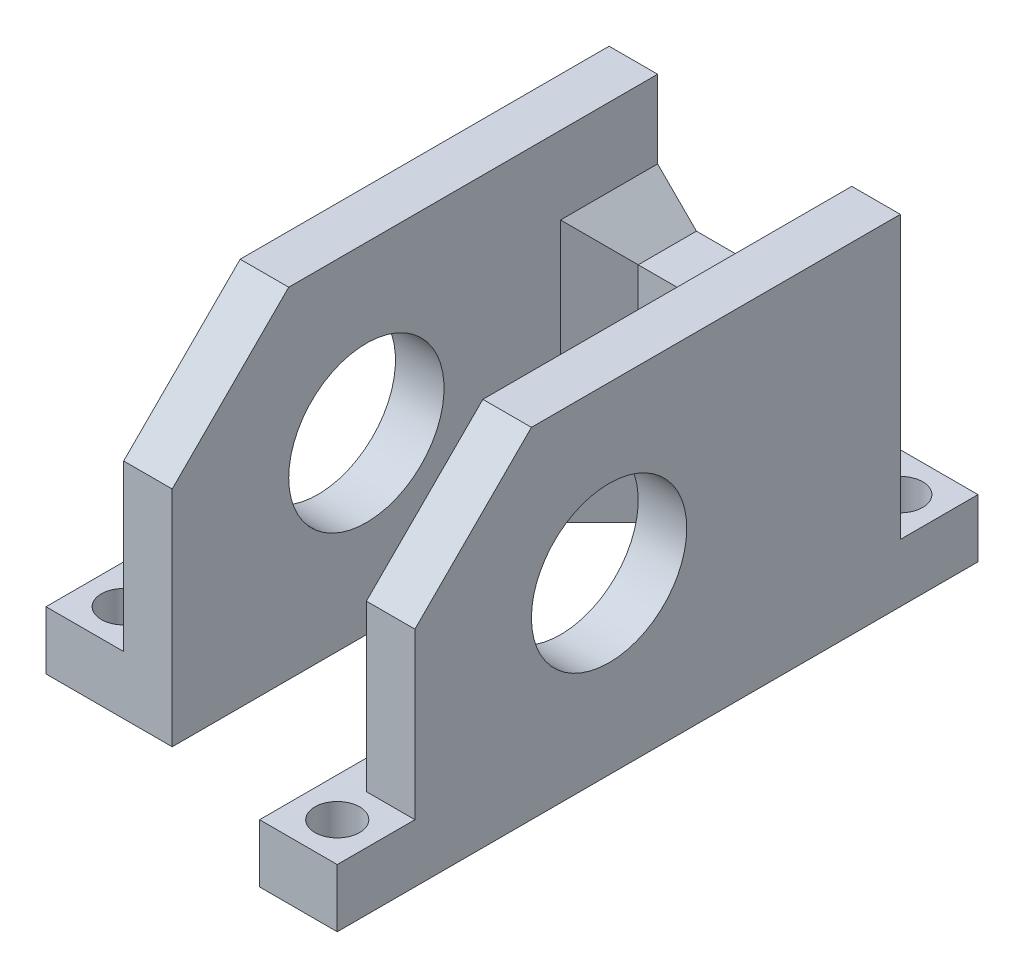
ISO-10303-21;
HEADER;
FILE_DESCRIPTION(('STEP AP214'),'2;1');
FILE_NAME('part.step','',(''),(''),'','','');
FILE_SCHEMA(('AUTOMOTIVE_DESIGN { 1 0 10303 214 1 1 1 1 }'));
ENDSEC;
DATA;
#1=APPLICATION_CONTEXT('core data for automotive mechanical design processes');
#2=APPLICATION_PROTOCOL_DEFINITION('international standard','automotive_design',2000,#1);
#3=PRODUCT_CONTEXT('',#1,'mechanical');
#4=PRODUCT('Part','Part','',(#3));
#5=PRODUCT_RELATED_PRODUCT_CATEGORY('part','',(#4));
#6=PRODUCT_DEFINITION_FORMATION('','',#4);
#7=PRODUCT_DEFINITION_CONTEXT('part definition',#1,'design');
#8=PRODUCT_DEFINITION('design','',#6,#7);
#9=PRODUCT_DEFINITION_SHAPE('','',#8);
#10=(LENGTH_UNIT() NAMED_UNIT(*) SI_UNIT(.MILLI.,.METRE.));
#11=(NAMED_UNIT(*) PLANE_ANGLE_UNIT() SI_UNIT($,.RADIAN.));
#12=(NAMED_UNIT(*) SI_UNIT($,.STERADIAN.) SOLID_ANGLE_UNIT());
#13=UNCERTAINTY_MEASURE_WITH_UNIT(LENGTH_MEASURE(1.E-05),#10,'distance_accuracy_value','');
#14=(GEOMETRIC_REPRESENTATION_CONTEXT(3) GLOBAL_UNCERTAINTY_ASSIGNED_CONTEXT((#13)) GLOBAL_UNIT_ASSIGNED_CONTEXT((#10,
#11,#12)) REPRESENTATION_CONTEXT('',''));
#15=CARTESIAN_POINT('',(0.,0.,0.));
#16=DIRECTION('',(0.,0.,1.));
#17=DIRECTION('',(1.,0.,0.));
#18=AXIS2_PLACEMENT_3D('',#15,#16,#17);
#19=CARTESIAN_POINT('',(0.,35.,-9.));
#20=DIRECTION('',(0.,0.,-1.));
#21=DIRECTION('',(-1.,0.,0.));
#22=AXIS2_PLACEMENT_3D('',#19,#20,#21);
#23=PLANE('',#22);
#24=DIRECTION('',(-0.707106781186548,-0.707106781186548,0.));
#25=VECTOR('',#24,1.);
#26=CARTESIAN_POINT('',(-12.5,12.5,-9.));
#27=LINE('',#26,#25);
#28=CARTESIAN_POINT('',(2.,27.,-9.));
#29=VERTEX_POINT('',#28);
#30=CARTESIAN_POINT('',(-2.,23.,-9.));
#31=VERTEX_POINT('',#30);
#32=EDGE_CURVE('E510',#29,#31,#27,.T.);
#33=ORIENTED_EDGE('',*,*,#32,.F.);
#34=DIRECTION('',(0.,1.,0.));
#35=VECTOR('',#34,1.);
#36=CARTESIAN_POINT('',(2.,0.,-9.));
#37=LINE('',#36,#35);
#38=CARTESIAN_POINT('',(2.,35.,-9.));
#39=VERTEX_POINT('',#38);
#40=EDGE_CURVE('E507',#29,#39,#37,.T.);
#41=ORIENTED_EDGE('',*,*,#40,.T.);
#42=DIRECTION('',(1.,0.,0.));
#43=VECTOR('',#42,1.);
#44=CARTESIAN_POINT('',(0.,35.,-9.));
#45=LINE('',#44,#43);
#46=CARTESIAN_POINT('',(7.,35.,-9.));
#47=VERTEX_POINT('',#46);
#48=EDGE_CURVE('E244',#39,#47,#45,.T.);
#49=ORIENTED_EDGE('',*,*,#48,.T.);
#50=DIRECTION('',(0.,-1.,0.));
#51=VECTOR('',#50,1.);
#52=CARTESIAN_POINT('',(7.,35.,-9.));
#53=LINE('',#52,#51);
#54=CARTESIAN_POINT('',(7.,6.,-9.));
#55=VERTEX_POINT('',#54);
#56=EDGE_CURVE('E252',#47,#55,#53,.T.);
#57=ORIENTED_EDGE('',*,*,#56,.T.);
#58=DIRECTION('',(1.,0.,0.));
#59=VECTOR('',#58,1.);
#60=CARTESIAN_POINT('',(0.,6.,-9.));
#61=LINE('',#60,#59);
#62=CARTESIAN_POINT('',(-1.00000000000001,6.,-9.));
#63=VERTEX_POINT('',#62);
#64=EDGE_CURVE('E424',#63,#55,#61,.T.);
#65=ORIENTED_EDGE('',*,*,#64,.F.);
#66=DIRECTION('',(0.,-1.,0.));
#67=VECTOR('',#66,1.);
#68=CARTESIAN_POINT('',(-1.00000000000001,6.,-9.));
#69=LINE('',#68,#67);
#70=CARTESIAN_POINT('',(-1.00000000000001,0.,-9.));
#71=VERTEX_POINT('',#70);
#72=EDGE_CURVE('E437',#63,#71,#69,.T.);
#73=ORIENTED_EDGE('',*,*,#72,.T.);
#74=DIRECTION('',(1.,0.,0.));
#75=VECTOR('',#74,1.);
#76=CARTESIAN_POINT('',(0.,0.,-9.));
#77=LINE('',#76,#75);
#78=CARTESIAN_POINT('',(-31.,0.,-8.99999999999999));
#79=VERTEX_POINT('',#78);
#80=EDGE_CURVE('E253',#79,#71,#77,.T.);
#81=ORIENTED_EDGE('',*,*,#80,.F.);
#82=DIRECTION('',(0.,-1.,0.));
#83=VECTOR('',#82,1.);
#84=CARTESIAN_POINT('',(-31.,6.,-8.99999999999999));
#85=LINE('',#84,#83);
#86=CARTESIAN_POINT('',(-31.,6.,-8.99999999999999));
#87=VERTEX_POINT('',#86);
#88=EDGE_CURVE('E327',#87,#79,#85,.T.);
#89=ORIENTED_EDGE('',*,*,#88,.F.);
#90=DIRECTION('',(-1.,0.,0.));
#91=VECTOR('',#90,1.);
#92=CARTESIAN_POINT('',(0.,6.,-9.00000000000002));
#93=LINE('',#92,#91);
#94=CARTESIAN_POINT('',(-23.,6.,-9.));
#95=VERTEX_POINT('',#94);
#96=EDGE_CURVE('E325',#95,#87,#93,.T.);
#97=ORIENTED_EDGE('',*,*,#96,.F.);
#98=DIRECTION('',(0.,-1.,0.));
#99=VECTOR('',#98,1.);
#100=CARTESIAN_POINT('',(-23.,35.,-9.));
#101=LINE('',#100,#99);
#102=CARTESIAN_POINT('',(-23.,35.,-9.));
#103=VERTEX_POINT('',#102);
#104=EDGE_CURVE('E282',#103,#95,#101,.T.);
#105=ORIENTED_EDGE('',*,*,#104,.F.);
#106=CARTESIAN_POINT('',(-18.,35.,-9.));
#107=VERTEX_POINT('',#106);
#108=EDGE_CURVE('E239',#103,#107,#45,.T.);
#109=ORIENTED_EDGE('',*,*,#108,.T.);
#110=DIRECTION('',(0.,1.,0.));
#111=VECTOR('',#110,1.);
#112=CARTESIAN_POINT('',(-18.,0.,-9.));
#113=LINE('',#112,#111);
#114=CARTESIAN_POINT('',(-18.,27.,-9.));
#115=VERTEX_POINT('',#114);
#116=EDGE_CURVE('E504',#115,#107,#113,.T.);
#117=ORIENTED_EDGE('',*,*,#116,.F.);
#118=DIRECTION('',(0.707106781186548,-0.707106781186548,0.));
#119=VECTOR('',#118,1.);
#120=CARTESIAN_POINT('',(4.5,4.5,-9.));
#121=LINE('',#120,#119);
#122=CARTESIAN_POINT('',(-14.,23.,-9.));
#123=VERTEX_POINT('',#122);
#124=EDGE_CURVE('E501',#115,#123,#121,.T.);
#125=ORIENTED_EDGE('',*,*,#124,.T.);
#126=DIRECTION('',(-1.,0.,0.));
#127=VECTOR('',#126,1.);
#128=CARTESIAN_POINT('',(0.,23.,-9.));
#129=LINE('',#128,#127);
#130=EDGE_CURVE('E513',#31,#123,#129,.T.);
#131=ORIENTED_EDGE('',*,*,#130,.F.);
#132=EDGE_LOOP('',(#33,#41,#49,#57,#65,#73,#81,#89,#97,#105,#109,#117,#125,#131));
#133=FACE_BOUND('',#132,.T.);
#134=ADVANCED_FACE('F39',(#133),#23,.T.);
#135=CARTESIAN_POINT('',(0.,35.,0.));
#136=DIRECTION('',(0.,1.,0.));
#137=DIRECTION('',(0.,0.,1.));
#138=AXIS2_PLACEMENT_3D('',#135,#136,#137);
#139=PLANE('',#138);
#140=DIRECTION('',(-1.,0.,0.));
#141=VECTOR('',#140,1.);
#142=CARTESIAN_POINT('',(27.,35.,29.));
#143=LINE('',#142,#141);
#144=CARTESIAN_POINT('',(7.,35.,29.));
#145=VERTEX_POINT('',#144);
#146=CARTESIAN_POINT('',(2.00000000000001,35.,29.));
#147=VERTEX_POINT('',#146);
#148=EDGE_CURVE('E235',#145,#147,#143,.T.);
#149=ORIENTED_EDGE('',*,*,#148,.F.);
#150=DIRECTION('',(0.,0.,1.));
#151=VECTOR('',#150,1.);
#152=CARTESIAN_POINT('',(7.,35.,0.));
#153=LINE('',#152,#151);
#154=EDGE_CURVE('E249',#47,#145,#153,.T.);
#155=ORIENTED_EDGE('',*,*,#154,.F.);
#156=ORIENTED_EDGE('',*,*,#48,.F.);
#157=DIRECTION('',(0.,0.,-1.));
#158=VECTOR('',#157,1.);
#159=CARTESIAN_POINT('',(2.00000000000001,35.,0.));
#160=LINE('',#159,#158);
#161=EDGE_CURVE('E242',#147,#39,#160,.T.);
#162=ORIENTED_EDGE('',*,*,#161,.F.);
#163=EDGE_LOOP('',(#149,#155,#156,#162));
#164=FACE_BOUND('',#163,.T.);
#165=ADVANCED_FACE('F558',(#164),#139,.T.);
#166=CARTESIAN_POINT('',(-18.,35.,1.));
#167=DIRECTION('',(0.707106781186547,0.,0.707106781186548));
#168=DIRECTION('',(0.707106781186548,0.,-0.707106781186547));
#169=AXIS2_PLACEMENT_3D('',#166,#167,#168);
#170=PLANE('',#169);
#171=DIRECTION('',(0.,-1.,0.));
#172=VECTOR('',#171,1.);
#173=CARTESIAN_POINT('',(-14.,35.,-3.));
#174=LINE('',#173,#172);
#175=CARTESIAN_POINT('',(-14.,23.,-2.99999999999999));
#176=VERTEX_POINT('',#175);
#177=CARTESIAN_POINT('',(-14.,0.,-3.));
#178=VERTEX_POINT('',#177);
#179=EDGE_CURVE('E295',#176,#178,#174,.T.);
#180=ORIENTED_EDGE('',*,*,#179,.F.);
#181=DIRECTION('',(-0.577350269189626,0.577350269189626,0.577350269189625));
#182=VECTOR('',#181,1.);
#183=CARTESIAN_POINT('',(-20.6666666666667,29.6666666666667,3.66666666666667));
#184=LINE('',#183,#182);
#185=CARTESIAN_POINT('',(-18.,27.,1.));
#186=VERTEX_POINT('',#185);
#187=EDGE_CURVE('E287',#176,#186,#184,.T.);
#188=ORIENTED_EDGE('',*,*,#187,.T.);
#189=DIRECTION('',(0.,-1.,0.));
#190=VECTOR('',#189,1.);
#191=CARTESIAN_POINT('',(-18.,35.,1.));
#192=LINE('',#191,#190);
#193=CARTESIAN_POINT('',(-18.,0.,0.999999999999997));
#194=VERTEX_POINT('',#193);
#195=EDGE_CURVE('E307',#186,#194,#192,.T.);
#196=ORIENTED_EDGE('',*,*,#195,.T.);
#197=DIRECTION('',(-0.707106781186548,0.,0.707106781186547));
#198=VECTOR('',#197,1.);
#199=CARTESIAN_POINT('',(-18.,0.,1.));
#200=LINE('',#199,#198);
#201=EDGE_CURVE('E306',#178,#194,#200,.T.);
#202=ORIENTED_EDGE('',*,*,#201,.F.);
#203=EDGE_LOOP('',(#180,#188,#196,#202));
#204=FACE_BOUND('',#203,.T.);
#205=ADVANCED_FACE('F303',(#204),#170,.T.);
#206=CARTESIAN_POINT('',(-23.,35.,0.));
#207=DIRECTION('',(1.,0.,0.));
#208=DIRECTION('',(0.,0.,-1.));
#209=AXIS2_PLACEMENT_3D('',#206,#207,#208);
#210=PLANE('',#209);
#211=CARTESIAN_POINT('',(-23.,18.,21.));
#212=DIRECTION('',(-1.,0.,0.));
#213=DIRECTION('',(0.,0.,1.));
#214=AXIS2_PLACEMENT_3D('',#211,#212,#213);
#215=CIRCLE('',#214,8.);
#216=CARTESIAN_POINT('',(-23.,18.,29.));
#217=VERTEX_POINT('',#216);
#218=EDGE_CURVE('E485',#217,#217,#215,.T.);
#219=ORIENTED_EDGE('',*,*,#218,.F.);
#220=EDGE_LOOP('',(#219));
#221=FACE_BOUND('',#220,.T.);
#222=DIRECTION('',(0.,-1.,0.));
#223=VECTOR('',#222,1.);
#224=CARTESIAN_POINT('',(-23.,35.,41.));
#225=LINE('',#224,#223);
#226=CARTESIAN_POINT('',(-23.,23.,41.));
#227=VERTEX_POINT('',#226);
#228=CARTESIAN_POINT('',(-23.,6.,41.));
#229=VERTEX_POINT('',#228);
#230=EDGE_CURVE('E234',#227,#229,#225,.T.);
#231=ORIENTED_EDGE('',*,*,#230,.F.);
#232=DIRECTION('',(0.,-0.707106781186548,0.707106781186548));
#233=VECTOR('',#232,1.);
#234=CARTESIAN_POINT('',(-23.,32.,32.));
#235=LINE('',#234,#233);
#236=CARTESIAN_POINT('',(-23.,35.,29.));
#237=VERTEX_POINT('',#236);
#238=EDGE_CURVE('E222',#237,#227,#235,.T.);
#239=ORIENTED_EDGE('',*,*,#238,.F.);
#240=DIRECTION('',(0.,0.,1.));
#241=VECTOR('',#240,1.);
#242=CARTESIAN_POINT('',(-23.,35.,0.));
#243=LINE('',#242,#241);
#244=EDGE_CURVE('E231',#103,#237,#243,.T.);
#245=ORIENTED_EDGE('',*,*,#244,.F.);
#246=ORIENTED_EDGE('',*,*,#104,.T.);
#247=DIRECTION('',(0.,0.,1.));
#248=VECTOR('',#247,1.);
#249=CARTESIAN_POINT('',(-23.,6.,0.));
#250=LINE('',#249,#248);
#251=CARTESIAN_POINT('',(-23.,6.,-0.999999999999994));
#252=VERTEX_POINT('',#251);
#253=EDGE_CURVE('E323',#95,#252,#250,.T.);
#254=ORIENTED_EDGE('',*,*,#253,.T.);
#255=DIRECTION('',(0.,-1.,0.));
#256=VECTOR('',#255,1.);
#257=CARTESIAN_POINT('',(-23.,6.,-0.999999999999994));
#258=LINE('',#257,#256);
#259=CARTESIAN_POINT('',(-23.,0.,-0.999999999999994));
#260=VERTEX_POINT('',#259);
#261=EDGE_CURVE('E337',#252,#260,#258,.T.);
#262=ORIENTED_EDGE('',*,*,#261,.T.);
#263=DIRECTION('',(0.,0.,1.));
#264=VECTOR('',#263,1.);
#265=CARTESIAN_POINT('',(-23.,0.,0.));
#266=LINE('',#265,#264);
#267=CARTESIAN_POINT('',(-23.,0.,33.));
#268=VERTEX_POINT('',#267);
#269=EDGE_CURVE('E256',#260,#268,#266,.T.);
#270=ORIENTED_EDGE('',*,*,#269,.T.);
#271=DIRECTION('',(0.,-1.,0.));
#272=VECTOR('',#271,1.);
#273=CARTESIAN_POINT('',(-23.,6.,33.));
#274=LINE('',#273,#272);
#275=CARTESIAN_POINT('',(-23.,6.,33.));
#276=VERTEX_POINT('',#275);
#277=EDGE_CURVE('E358',#276,#268,#274,.T.);
#278=ORIENTED_EDGE('',*,*,#277,.F.);
#279=DIRECTION('',(0.,0.,1.));
#280=VECTOR('',#279,1.);
#281=CARTESIAN_POINT('',(-23.,6.,0.));
#282=LINE('',#281,#280);
#283=EDGE_CURVE('E356',#276,#229,#282,.T.);
#284=ORIENTED_EDGE('',*,*,#283,.T.);
#285=EDGE_LOOP('',(#231,#239,#245,#246,#254,#262,#270,#278,#284));
#286=FACE_BOUND('',#285,.T.);
#287=ADVANCED_FACE('F230',(#221,#286),#210,.F.);
#288=CARTESIAN_POINT('',(0.,35.,41.));
#289=DIRECTION('',(0.,0.,-1.));
#290=DIRECTION('',(-1.,0.,0.));
#291=AXIS2_PLACEMENT_3D('',#288,#289,#290);
#292=PLANE('',#291);
#293=DIRECTION('',(0.,-1.,0.));
#294=VECTOR('',#293,1.);
#295=CARTESIAN_POINT('',(-18.,35.,41.));
#296=LINE('',#295,#294);
#297=CARTESIAN_POINT('',(-18.,23.,41.));
#298=VERTEX_POINT('',#297);
#299=CARTESIAN_POINT('',(-18.,0.,41.));
#300=VERTEX_POINT('',#299);
#301=EDGE_CURVE('E279',#298,#300,#296,.T.);
#302=ORIENTED_EDGE('',*,*,#301,.F.);
#303=DIRECTION('',(-1.,0.,0.));
#304=VECTOR('',#303,1.);
#305=CARTESIAN_POINT('',(27.,23.,41.));
#306=LINE('',#305,#304);
#307=EDGE_CURVE('E483',#298,#227,#306,.T.);
#308=ORIENTED_EDGE('',*,*,#307,.T.);
#309=ORIENTED_EDGE('',*,*,#230,.T.);
#310=DIRECTION('',(-1.,0.,0.));
#311=VECTOR('',#310,1.);
#312=CARTESIAN_POINT('',(0.,6.,41.));
#313=LINE('',#312,#311);
#314=CARTESIAN_POINT('',(-31.,6.,41.));
#315=VERTEX_POINT('',#314);
#316=EDGE_CURVE('E353',#229,#315,#313,.T.);
#317=ORIENTED_EDGE('',*,*,#316,.T.);
#318=DIRECTION('',(0.,-1.,0.));
#319=VECTOR('',#318,1.);
#320=CARTESIAN_POINT('',(-31.,6.,41.));
#321=LINE('',#320,#319);
#322=CARTESIAN_POINT('',(-31.,0.,41.));
#323=VERTEX_POINT('',#322);
#324=EDGE_CURVE('E368',#315,#323,#321,.T.);
#325=ORIENTED_EDGE('',*,*,#324,.T.);
#326=DIRECTION('',(1.,0.,0.));
#327=VECTOR('',#326,1.);
#328=CARTESIAN_POINT('',(0.,0.,41.));
#329=LINE('',#328,#327);
#330=EDGE_CURVE('E259',#323,#300,#329,.T.);
#331=ORIENTED_EDGE('',*,*,#330,.T.);
#332=EDGE_LOOP('',(#302,#308,#309,#317,#325,#331));
#333=FACE_BOUND('',#332,.T.);
#334=ADVANCED_FACE('F482',(#333),#292,.F.);
#335=CARTESIAN_POINT('',(-18.,35.,0.));
#336=DIRECTION('',(-1.,0.,0.));
#337=DIRECTION('',(0.,0.,1.));
#338=AXIS2_PLACEMENT_3D('',#335,#336,#337);
#339=PLANE('',#338);
#340=CARTESIAN_POINT('',(-18.,18.,21.));
#341=DIRECTION('',(-1.,0.,0.));
#342=DIRECTION('',(0.,0.,1.));
#343=AXIS2_PLACEMENT_3D('',#340,#341,#342);
#344=CIRCLE('',#343,8.);
#345=CARTESIAN_POINT('',(-18.,18.,29.));
#346=VERTEX_POINT('',#345);
#347=EDGE_CURVE('E498',#346,#346,#344,.T.);
#348=ORIENTED_EDGE('',*,*,#347,.T.);
#349=EDGE_LOOP('',(#348));
#350=FACE_BOUND('',#349,.T.);
#351=DIRECTION('',(0.,0.,-1.));
#352=VECTOR('',#351,1.);
#353=CARTESIAN_POINT('',(-18.,35.,0.));
#354=LINE('',#353,#352);
#355=CARTESIAN_POINT('',(-18.,35.,29.));
#356=VERTEX_POINT('',#355);
#357=EDGE_CURVE('E240',#356,#107,#354,.T.);
#358=ORIENTED_EDGE('',*,*,#357,.F.);
#359=DIRECTION('',(0.,-0.707106781186548,0.707106781186548));
#360=VECTOR('',#359,1.);
#361=CARTESIAN_POINT('',(-18.,49.5,14.5));
#362=LINE('',#361,#360);
#363=EDGE_CURVE('E61',#356,#298,#362,.T.);
#364=ORIENTED_EDGE('',*,*,#363,.T.);
#365=ORIENTED_EDGE('',*,*,#301,.T.);
#366=DIRECTION('',(0.,0.,-1.));
#367=VECTOR('',#366,1.);
#368=CARTESIAN_POINT('',(-18.,0.,0.));
#369=LINE('',#368,#367);
#370=EDGE_CURVE('E262',#300,#194,#369,.T.);
#371=ORIENTED_EDGE('',*,*,#370,.T.);
#372=ORIENTED_EDGE('',*,*,#195,.F.);
#373=DIRECTION('',(0.,0.,-1.));
#374=VECTOR('',#373,1.);
#375=CARTESIAN_POINT('',(-18.,27.,26.));
#376=LINE('',#375,#374);
#377=EDGE_CURVE('E516',#186,#115,#376,.T.);
#378=ORIENTED_EDGE('',*,*,#377,.T.);
#379=ORIENTED_EDGE('',*,*,#116,.T.);
#380=EDGE_LOOP('',(#358,#364,#365,#371,#372,#378,#379));
#381=FACE_BOUND('',#380,.T.);
#382=ADVANCED_FACE('F544',(#350,#381),#339,.F.);
#383=CARTESIAN_POINT('',(0.,35.,-3.));
#384=DIRECTION('',(0.,0.,-1.));
#385=DIRECTION('',(-1.,0.,0.));
#386=AXIS2_PLACEMENT_3D('',#383,#384,#385);
#387=PLANE('',#386);
#388=DIRECTION('',(0.,-1.,0.));
#389=VECTOR('',#388,1.);
#390=CARTESIAN_POINT('',(-1.99999999999999,35.,-3.));
#391=LINE('',#390,#389);
#392=CARTESIAN_POINT('',(-2.,23.,-3.00000000000001));
#393=VERTEX_POINT('',#392);
#394=CARTESIAN_POINT('',(-1.99999999999999,0.,-3.));
#395=VERTEX_POINT('',#394);
#396=EDGE_CURVE('E297',#393,#395,#391,.T.);
#397=ORIENTED_EDGE('',*,*,#396,.F.);
#398=DIRECTION('',(-1.,0.,0.));
#399=VECTOR('',#398,1.);
#400=CARTESIAN_POINT('',(0.,23.,-3.));
#401=LINE('',#400,#399);
#402=EDGE_CURVE('E47',#393,#176,#401,.T.);
#403=ORIENTED_EDGE('',*,*,#402,.T.);
#404=ORIENTED_EDGE('',*,*,#179,.T.);
#405=DIRECTION('',(1.,0.,0.));
#406=VECTOR('',#405,1.);
#407=CARTESIAN_POINT('',(0.,0.,-3.));
#408=LINE('',#407,#406);
#409=EDGE_CURVE('E265',#178,#395,#408,.T.);
#410=ORIENTED_EDGE('',*,*,#409,.T.);
#411=EDGE_LOOP('',(#397,#403,#404,#410));
#412=FACE_BOUND('',#411,.T.);
#413=ADVANCED_FACE('F294',(#412),#387,.F.);
#414=CARTESIAN_POINT('',(2.00000000000001,35.,0.));
#415=DIRECTION('',(-1.,0.,0.));
#416=DIRECTION('',(0.,0.,1.));
#417=AXIS2_PLACEMENT_3D('',#414,#415,#416);
#418=PLANE('',#417);
#419=DIRECTION('',(0.,-0.707106781186548,0.707106781186548));
#420=VECTOR('',#419,1.);
#421=CARTESIAN_POINT('',(2.00000000000001,49.5,14.5));
#422=LINE('',#421,#420);
#423=CARTESIAN_POINT('',(2.00000000000001,23.,41.));
#424=VERTEX_POINT('',#423);
#425=EDGE_CURVE('E492',#147,#424,#422,.T.);
#426=ORIENTED_EDGE('',*,*,#425,.F.);
#427=ORIENTED_EDGE('',*,*,#161,.T.);
#428=ORIENTED_EDGE('',*,*,#40,.F.);
#429=DIRECTION('',(0.,0.,-1.));
#430=VECTOR('',#429,1.);
#431=CARTESIAN_POINT('',(2.,27.,26.));
#432=LINE('',#431,#430);
#433=CARTESIAN_POINT('',(2.00000000000001,27.,1.00000000000001));
#434=VERTEX_POINT('',#433);
#435=EDGE_CURVE('E522',#434,#29,#432,.T.);
#436=ORIENTED_EDGE('',*,*,#435,.F.);
#437=DIRECTION('',(0.,-1.,0.));
#438=VECTOR('',#437,1.);
#439=CARTESIAN_POINT('',(2.00000000000001,35.,1.00000000000001));
#440=LINE('',#439,#438);
#441=CARTESIAN_POINT('',(2.00000000000001,0.,1.00000000000001));
#442=VERTEX_POINT('',#441);
#443=EDGE_CURVE('E527',#434,#442,#440,.T.);
#444=ORIENTED_EDGE('',*,*,#443,.T.);
#445=DIRECTION('',(0.,0.,-1.));
#446=VECTOR('',#445,1.);
#447=CARTESIAN_POINT('',(2.00000000000001,0.,0.));
#448=LINE('',#447,#446);
#449=CARTESIAN_POINT('',(2.00000000000001,0.,37.));
#450=VERTEX_POINT('',#449);
#451=EDGE_CURVE('E268',#450,#442,#448,.T.);
#452=ORIENTED_EDGE('',*,*,#451,.F.);
#453=DIRECTION('',(0.,-1.,0.));
#454=VECTOR('',#453,1.);
#455=CARTESIAN_POINT('',(2.00000000000001,6.,37.));
#456=LINE('',#455,#454);
#457=CARTESIAN_POINT('',(2.00000000000001,6.,37.));
#458=VERTEX_POINT('',#457);
#459=EDGE_CURVE('E395',#458,#450,#456,.T.);
#460=ORIENTED_EDGE('',*,*,#459,.F.);
#461=DIRECTION('',(0.,0.,-1.));
#462=VECTOR('',#461,1.);
#463=CARTESIAN_POINT('',(2.00000000000001,6.,0.));
#464=LINE('',#463,#462);
#465=CARTESIAN_POINT('',(2.00000000000001,6.,41.));
#466=VERTEX_POINT('',#465);
#467=EDGE_CURVE('E393',#466,#458,#464,.T.);
#468=ORIENTED_EDGE('',*,*,#467,.F.);
#469=DIRECTION('',(0.,-1.,0.));
#470=VECTOR('',#469,1.);
#471=CARTESIAN_POINT('',(2.00000000000001,35.,41.));
#472=LINE('',#471,#470);
#473=EDGE_CURVE('E277',#424,#466,#472,.T.);
#474=ORIENTED_EDGE('',*,*,#473,.F.);
#475=EDGE_LOOP('',(#426,#427,#428,#436,#444,#452,#460,#468,#474));
#476=FACE_BOUND('',#475,.T.);
#477=CARTESIAN_POINT('',(2.00000000000001,18.,21.));
#478=DIRECTION('',(-1.,0.,0.));
#479=DIRECTION('',(0.,0.,1.));
#480=AXIS2_PLACEMENT_3D('',#477,#478,#479);
#481=CIRCLE('',#480,8.);
#482=CARTESIAN_POINT('',(2.00000000000001,18.,29.));
#483=VERTEX_POINT('',#482);
#484=EDGE_CURVE('E495',#483,#483,#481,.T.);
#485=ORIENTED_EDGE('',*,*,#484,.F.);
#486=EDGE_LOOP('',(#485));
#487=FACE_BOUND('',#486,.T.);
#488=ADVANCED_FACE('F533',(#476,#487),#418,.T.);
#489=CARTESIAN_POINT('',(0.,35.,41.));
#490=DIRECTION('',(0.,0.,1.));
#491=DIRECTION('',(1.,0.,0.));
#492=AXIS2_PLACEMENT_3D('',#489,#490,#491);
#493=PLANE('',#492);
#494=CARTESIAN_POINT('',(7.,23.,41.));
#495=VERTEX_POINT('',#494);
#496=EDGE_CURVE('E54',#495,#424,#306,.T.);
#497=ORIENTED_EDGE('',*,*,#496,.T.);
#498=ORIENTED_EDGE('',*,*,#473,.T.);
#499=DIRECTION('',(-1.,0.,0.));
#500=VECTOR('',#499,1.);
#501=CARTESIAN_POINT('',(0.,6.,41.));
#502=LINE('',#501,#500);
#503=CARTESIAN_POINT('',(7.,6.,41.));
#504=VERTEX_POINT('',#503);
#505=EDGE_CURVE('E390',#504,#466,#502,.T.);
#506=ORIENTED_EDGE('',*,*,#505,.F.);
#507=DIRECTION('',(0.,-1.,0.));
#508=VECTOR('',#507,1.);
#509=CARTESIAN_POINT('',(7.,35.,41.));
#510=LINE('',#509,#508);
#511=EDGE_CURVE('E275',#495,#504,#510,.T.);
#512=ORIENTED_EDGE('',*,*,#511,.F.);
#513=EDGE_LOOP('',(#497,#498,#506,#512));
#514=FACE_BOUND('',#513,.T.);
#515=ADVANCED_FACE('F584',(#514),#493,.T.);
#516=CARTESIAN_POINT('',(7.,35.,0.));
#517=DIRECTION('',(1.,0.,0.));
#518=DIRECTION('',(0.,0.,-1.));
#519=AXIS2_PLACEMENT_3D('',#516,#517,#518);
#520=PLANE('',#519);
#521=DIRECTION('',(0.,0.707106781186548,-0.707106781186548));
#522=VECTOR('',#521,1.);
#523=CARTESIAN_POINT('',(7.,49.5,14.5));
#524=LINE('',#523,#522);
#525=EDGE_CURVE('E490',#495,#145,#524,.T.);
#526=ORIENTED_EDGE('',*,*,#525,.F.);
#527=ORIENTED_EDGE('',*,*,#511,.T.);
#528=DIRECTION('',(0.,0.,1.));
#529=VECTOR('',#528,1.);
#530=CARTESIAN_POINT('',(7.,6.,0.));
#531=LINE('',#530,#529);
#532=CARTESIAN_POINT('',(7.,6.,49.));
#533=VERTEX_POINT('',#532);
#534=EDGE_CURVE('E387',#504,#533,#531,.T.);
#535=ORIENTED_EDGE('',*,*,#534,.T.);
#536=DIRECTION('',(0.,-1.,0.));
#537=VECTOR('',#536,1.);
#538=CARTESIAN_POINT('',(7.,6.,49.));
#539=LINE('',#538,#537);
#540=CARTESIAN_POINT('',(7.,0.,49.));
#541=VERTEX_POINT('',#540);
#542=EDGE_CURVE('E407',#533,#541,#539,.T.);
#543=ORIENTED_EDGE('',*,*,#542,.T.);
#544=DIRECTION('',(0.,0.,1.));
#545=VECTOR('',#544,1.);
#546=CARTESIAN_POINT('',(7.,0.,0.));
#547=LINE('',#546,#545);
#548=CARTESIAN_POINT('',(7.,0.,-17.));
#549=VERTEX_POINT('',#548);
#550=EDGE_CURVE('E271',#549,#541,#547,.T.);
#551=ORIENTED_EDGE('',*,*,#550,.F.);
#552=DIRECTION('',(0.,-1.,0.));
#553=VECTOR('',#552,1.);
#554=CARTESIAN_POINT('',(7.,6.,-17.));
#555=LINE('',#554,#553);
#556=CARTESIAN_POINT('',(7.,6.,-17.));
#557=VERTEX_POINT('',#556);
#558=EDGE_CURVE('E428',#557,#549,#555,.T.);
#559=ORIENTED_EDGE('',*,*,#558,.F.);
#560=DIRECTION('',(0.,0.,-1.));
#561=VECTOR('',#560,1.);
#562=CARTESIAN_POINT('',(7.,6.,0.));
#563=LINE('',#562,#561);
#564=EDGE_CURVE('E426',#55,#557,#563,.T.);
#565=ORIENTED_EDGE('',*,*,#564,.F.);
#566=ORIENTED_EDGE('',*,*,#56,.F.);
#567=ORIENTED_EDGE('',*,*,#154,.T.);
#568=EDGE_LOOP('',(#526,#527,#535,#543,#551,#559,#565,#566,#567));
#569=FACE_BOUND('',#568,.T.);
#570=CARTESIAN_POINT('',(7.,18.,21.));
#571=DIRECTION('',(1.,0.,0.));
#572=DIRECTION('',(0.,0.,-1.));
#573=AXIS2_PLACEMENT_3D('',#570,#571,#572);
#574=CIRCLE('',#573,8.);
#575=CARTESIAN_POINT('',(7.,18.,13.));
#576=VERTEX_POINT('',#575);
#577=EDGE_CURVE('E42',#576,#576,#574,.T.);
#578=ORIENTED_EDGE('',*,*,#577,.F.);
#579=EDGE_LOOP('',(#578));
#580=FACE_BOUND('',#579,.T.);
#581=ADVANCED_FACE('F560',(#569,#580),#520,.T.);
#582=DIRECTION('',(-1.,0.,0.));
#583=VECTOR('',#582,1.);
#584=CARTESIAN_POINT('',(0.,35.,29.));
#585=LINE('',#584,#583);
#586=EDGE_CURVE('E11',#356,#237,#585,.T.);
#587=ORIENTED_EDGE('',*,*,#586,.F.);
#588=ORIENTED_EDGE('',*,*,#357,.T.);
#589=ORIENTED_EDGE('',*,*,#108,.F.);
#590=ORIENTED_EDGE('',*,*,#244,.T.);
#591=EDGE_LOOP('',(#587,#588,#589,#590));
#592=FACE_BOUND('',#591,.T.);
#593=ADVANCED_FACE('F237',(#592),#139,.T.);
#594=CARTESIAN_POINT('',(0.,0.,0.));
#595=DIRECTION('',(0.,1.,0.));
#596=DIRECTION('',(0.,0.,1.));
#597=AXIS2_PLACEMENT_3D('',#594,#595,#596);
#598=PLANE('',#597);
#599=ORIENTED_EDGE('',*,*,#451,.T.);
#600=DIRECTION('',(-0.707106781186547,0.,-0.707106781186548));
#601=VECTOR('',#600,1.);
#602=CARTESIAN_POINT('',(-1.99999999999999,0.,-3.));
#603=LINE('',#602,#601);
#604=EDGE_CURVE('E519',#442,#395,#603,.T.);
#605=ORIENTED_EDGE('',*,*,#604,.T.);
#606=ORIENTED_EDGE('',*,*,#409,.F.);
#607=ORIENTED_EDGE('',*,*,#201,.T.);
#608=ORIENTED_EDGE('',*,*,#370,.F.);
#609=ORIENTED_EDGE('',*,*,#330,.F.);
#610=DIRECTION('',(0.,0.,-1.));
#611=VECTOR('',#610,1.);
#612=CARTESIAN_POINT('',(-31.,0.,0.));
#613=LINE('',#612,#611);
#614=CARTESIAN_POINT('',(-31.,0.,33.));
#615=VERTEX_POINT('',#614);
#616=EDGE_CURVE('E348',#323,#615,#613,.T.);
#617=ORIENTED_EDGE('',*,*,#616,.T.);
#618=DIRECTION('',(1.,0.,0.));
#619=VECTOR('',#618,1.);
#620=CARTESIAN_POINT('',(0.,0.,33.));
#621=LINE('',#620,#619);
#622=EDGE_CURVE('E361',#615,#268,#621,.T.);
#623=ORIENTED_EDGE('',*,*,#622,.T.);
#624=ORIENTED_EDGE('',*,*,#269,.F.);
#625=DIRECTION('',(1.,0.,0.));
#626=VECTOR('',#625,1.);
#627=CARTESIAN_POINT('',(0.,0.,-0.999999999999994));
#628=LINE('',#627,#626);
#629=CARTESIAN_POINT('',(-31.,0.,-0.999999999999994));
#630=VERTEX_POINT('',#629);
#631=EDGE_CURVE('E317',#630,#260,#628,.T.);
#632=ORIENTED_EDGE('',*,*,#631,.F.);
#633=DIRECTION('',(0.,0.,1.));
#634=VECTOR('',#633,1.);
#635=CARTESIAN_POINT('',(-31.,0.,0.));
#636=LINE('',#635,#634);
#637=EDGE_CURVE('E330',#79,#630,#636,.T.);
#638=ORIENTED_EDGE('',*,*,#637,.F.);
#639=ORIENTED_EDGE('',*,*,#80,.T.);
#640=DIRECTION('',(0.,0.,1.));
#641=VECTOR('',#640,1.);
#642=CARTESIAN_POINT('',(-1.00000000000001,0.,0.));
#643=LINE('',#642,#641);
#644=CARTESIAN_POINT('',(-1.00000000000001,0.,-17.));
#645=VERTEX_POINT('',#644);
#646=EDGE_CURVE('E419',#645,#71,#643,.T.);
#647=ORIENTED_EDGE('',*,*,#646,.F.);
#648=DIRECTION('',(-1.,0.,0.));
#649=VECTOR('',#648,1.);
#650=CARTESIAN_POINT('',(0.,0.,-17.));
#651=LINE('',#650,#649);
#652=EDGE_CURVE('E431',#549,#645,#651,.T.);
#653=ORIENTED_EDGE('',*,*,#652,.F.);
#654=ORIENTED_EDGE('',*,*,#550,.T.);
#655=DIRECTION('',(-1.,0.,0.));
#656=VECTOR('',#655,1.);
#657=CARTESIAN_POINT('',(0.,0.,49.));
#658=LINE('',#657,#656);
#659=CARTESIAN_POINT('',(-1.00000000000001,0.,49.));
#660=VERTEX_POINT('',#659);
#661=EDGE_CURVE('E378',#541,#660,#658,.T.);
#662=ORIENTED_EDGE('',*,*,#661,.T.);
#663=DIRECTION('',(0.,0.,-1.));
#664=VECTOR('',#663,1.);
#665=CARTESIAN_POINT('',(-1.00000000000001,0.,0.));
#666=LINE('',#665,#664);
#667=CARTESIAN_POINT('',(-1.00000000000001,0.,37.));
#668=VERTEX_POINT('',#667);
#669=EDGE_CURVE('E400',#660,#668,#666,.T.);
#670=ORIENTED_EDGE('',*,*,#669,.T.);
#671=DIRECTION('',(1.,0.,0.));
#672=VECTOR('',#671,1.);
#673=CARTESIAN_POINT('',(0.,0.,37.));
#674=LINE('',#673,#672);
#675=EDGE_CURVE('E398',#668,#450,#674,.T.);
#676=ORIENTED_EDGE('',*,*,#675,.T.);
#677=EDGE_LOOP('',(#599,#605,#606,#607,#608,#609,#617,#623,#624,#632,#638,#639,#647,#653,#654,
#662,#670,#676));
#678=FACE_BOUND('',#677,.T.);
#679=CARTESIAN_POINT('',(3.,0.,-13.));
#680=DIRECTION('',(0.,1.,0.));
#681=DIRECTION('',(0.,0.,1.));
#682=AXIS2_PLACEMENT_3D('',#679,#680,#681);
#683=CIRCLE('',#682,2.3);
#684=CARTESIAN_POINT('',(3.,0.,-10.7));
#685=VERTEX_POINT('',#684);
#686=EDGE_CURVE('E414',#685,#685,#683,.T.);
#687=ORIENTED_EDGE('',*,*,#686,.T.);
#688=EDGE_LOOP('',(#687));
#689=FACE_BOUND('',#688,.T.);
#690=CARTESIAN_POINT('',(3.,0.,45.));
#691=DIRECTION('',(0.,1.,0.));
#692=DIRECTION('',(0.,0.,1.));
#693=AXIS2_PLACEMENT_3D('',#690,#691,#692);
#694=CIRCLE('',#693,2.3);
#695=CARTESIAN_POINT('',(3.,0.,47.3));
#696=VERTEX_POINT('',#695);
#697=EDGE_CURVE('E373',#696,#696,#694,.T.);
#698=ORIENTED_EDGE('',*,*,#697,.T.);
#699=EDGE_LOOP('',(#698));
#700=FACE_BOUND('',#699,.T.);
#701=CARTESIAN_POINT('',(-27.,0.,37.));
#702=DIRECTION('',(0.,1.,0.));
#703=DIRECTION('',(0.,0.,1.));
#704=AXIS2_PLACEMENT_3D('',#701,#702,#703);
#705=CIRCLE('',#704,2.3);
#706=CARTESIAN_POINT('',(-27.,0.,39.3));
#707=VERTEX_POINT('',#706);
#708=EDGE_CURVE('E343',#707,#707,#705,.T.);
#709=ORIENTED_EDGE('',*,*,#708,.T.);
#710=EDGE_LOOP('',(#709));
#711=FACE_BOUND('',#710,.T.);
#712=CARTESIAN_POINT('',(-27.,0.,-4.99999999999999));
#713=DIRECTION('',(0.,1.,0.));
#714=DIRECTION('',(0.,0.,1.));
#715=AXIS2_PLACEMENT_3D('',#712,#713,#714);
#716=CIRCLE('',#715,2.3);
#717=CARTESIAN_POINT('',(-27.,0.,-2.69999999999999));
#718=VERTEX_POINT('',#717);
#719=EDGE_CURVE('E309',#718,#718,#716,.T.);
#720=ORIENTED_EDGE('',*,*,#719,.T.);
#721=EDGE_LOOP('',(#720));
#722=FACE_BOUND('',#721,.T.);
#723=ADVANCED_FACE('F450',(#678,#689,#700,#711,#722),#598,.F.);
#724=CARTESIAN_POINT('',(0.,6.,-17.));
#725=DIRECTION('',(0.,0.,1.));
#726=DIRECTION('',(1.,0.,0.));
#727=AXIS2_PLACEMENT_3D('',#724,#725,#726);
#728=PLANE('',#727);
#729=ORIENTED_EDGE('',*,*,#652,.T.);
#730=DIRECTION('',(0.,-1.,0.));
#731=VECTOR('',#730,1.);
#732=CARTESIAN_POINT('',(-1.00000000000001,6.,-17.));
#733=LINE('',#732,#731);
#734=CARTESIAN_POINT('',(-1.00000000000001,6.,-17.));
#735=VERTEX_POINT('',#734);
#736=EDGE_CURVE('E257',#735,#645,#733,.T.);
#737=ORIENTED_EDGE('',*,*,#736,.F.);
#738=DIRECTION('',(-1.,0.,0.));
#739=VECTOR('',#738,1.);
#740=CARTESIAN_POINT('',(0.,6.,-17.));
#741=LINE('',#740,#739);
#742=EDGE_CURVE('E418',#557,#735,#741,.T.);
#743=ORIENTED_EDGE('',*,*,#742,.F.);
#744=ORIENTED_EDGE('',*,*,#558,.T.);
#745=EDGE_LOOP('',(#729,#737,#743,#744));
#746=FACE_BOUND('',#745,.T.);
#747=ADVANCED_FACE('F447',(#746),#728,.F.);
#748=CARTESIAN_POINT('',(-1.00000000000001,6.,0.));
#749=DIRECTION('',(1.,0.,0.));
#750=DIRECTION('',(0.,0.,-1.));
#751=AXIS2_PLACEMENT_3D('',#748,#749,#750);
#752=PLANE('',#751);
#753=ORIENTED_EDGE('',*,*,#646,.T.);
#754=ORIENTED_EDGE('',*,*,#72,.F.);
#755=DIRECTION('',(0.,0.,1.));
#756=VECTOR('',#755,1.);
#757=CARTESIAN_POINT('',(-1.00000000000001,6.,0.));
#758=LINE('',#757,#756);
#759=EDGE_CURVE('E422',#735,#63,#758,.T.);
#760=ORIENTED_EDGE('',*,*,#759,.F.);
#761=ORIENTED_EDGE('',*,*,#736,.T.);
#762=EDGE_LOOP('',(#753,#754,#760,#761));
#763=FACE_BOUND('',#762,.T.);
#764=ADVANCED_FACE('F442',(#763),#752,.F.);
#765=CARTESIAN_POINT('',(3.,6.,-13.));
#766=DIRECTION('',(0.,-1.,0.));
#767=DIRECTION('',(0.,0.,-1.));
#768=AXIS2_PLACEMENT_3D('',#765,#766,#767);
#769=CYLINDRICAL_SURFACE('',#768,2.3);
#770=CARTESIAN_POINT('',(3.,6.,-13.));
#771=DIRECTION('',(0.,1.,0.));
#772=DIRECTION('',(0.,0.,1.));
#773=AXIS2_PLACEMENT_3D('',#770,#771,#772);
#774=CIRCLE('',#773,2.3);
#775=CARTESIAN_POINT('',(3.,6.,-10.7));
#776=VERTEX_POINT('',#775);
#777=EDGE_CURVE('E415',#776,#776,#774,.T.);
#778=ORIENTED_EDGE('',*,*,#777,.T.);
#779=EDGE_LOOP('',(#778));
#780=FACE_BOUND('',#779,.T.);
#781=ORIENTED_EDGE('',*,*,#686,.F.);
#782=EDGE_LOOP('',(#781));
#783=FACE_BOUND('',#782,.T.);
#784=ADVANCED_FACE('F615',(#780,#783),#769,.F.);
#785=CARTESIAN_POINT('',(0.,6.,0.));
#786=DIRECTION('',(0.,1.,0.));
#787=DIRECTION('',(0.,0.,1.));
#788=AXIS2_PLACEMENT_3D('',#785,#786,#787);
#789=PLANE('',#788);
#790=ORIENTED_EDGE('',*,*,#777,.F.);
#791=EDGE_LOOP('',(#790));
#792=FACE_BOUND('',#791,.T.);
#793=ORIENTED_EDGE('',*,*,#742,.T.);
#794=ORIENTED_EDGE('',*,*,#759,.T.);
#795=ORIENTED_EDGE('',*,*,#64,.T.);
#796=ORIENTED_EDGE('',*,*,#564,.T.);
#797=EDGE_LOOP('',(#793,#794,#795,#796));
#798=FACE_BOUND('',#797,.T.);
#799=ADVANCED_FACE('F565',(#792,#798),#789,.T.);
#800=CARTESIAN_POINT('',(0.,6.,37.));
#801=DIRECTION('',(0.,0.,-1.));
#802=DIRECTION('',(-1.,0.,0.));
#803=AXIS2_PLACEMENT_3D('',#800,#801,#802);
#804=PLANE('',#803);
#805=ORIENTED_EDGE('',*,*,#675,.F.);
#806=DIRECTION('',(0.,-1.,0.));
#807=VECTOR('',#806,1.);
#808=CARTESIAN_POINT('',(-1.00000000000001,6.,37.));
#809=LINE('',#808,#807);
#810=CARTESIAN_POINT('',(-1.00000000000001,6.,37.));
#811=VERTEX_POINT('',#810);
#812=EDGE_CURVE('E412',#811,#668,#809,.T.);
#813=ORIENTED_EDGE('',*,*,#812,.F.);
#814=DIRECTION('',(1.,0.,0.));
#815=VECTOR('',#814,1.);
#816=CARTESIAN_POINT('',(0.,6.,37.));
#817=LINE('',#816,#815);
#818=EDGE_CURVE('E377',#811,#458,#817,.T.);
#819=ORIENTED_EDGE('',*,*,#818,.T.);
#820=ORIENTED_EDGE('',*,*,#459,.T.);
#821=EDGE_LOOP('',(#805,#813,#819,#820));
#822=FACE_BOUND('',#821,.T.);
#823=ADVANCED_FACE('F577',(#822),#804,.T.);
#824=CARTESIAN_POINT('',(-1.00000000000001,6.,0.));
#825=DIRECTION('',(-1.,0.,0.));
#826=DIRECTION('',(0.,0.,1.));
#827=AXIS2_PLACEMENT_3D('',#824,#825,#826);
#828=PLANE('',#827);
#829=ORIENTED_EDGE('',*,*,#669,.F.);
#830=DIRECTION('',(0.,-1.,0.));
#831=VECTOR('',#830,1.);
#832=CARTESIAN_POINT('',(-1.00000000000001,6.,49.));
#833=LINE('',#832,#831);
#834=CARTESIAN_POINT('',(-1.00000000000001,6.,49.));
#835=VERTEX_POINT('',#834);
#836=EDGE_CURVE('E410',#835,#660,#833,.T.);
#837=ORIENTED_EDGE('',*,*,#836,.F.);
#838=DIRECTION('',(0.,0.,-1.));
#839=VECTOR('',#838,1.);
#840=CARTESIAN_POINT('',(-1.00000000000001,6.,0.));
#841=LINE('',#840,#839);
#842=EDGE_CURVE('E381',#835,#811,#841,.T.);
#843=ORIENTED_EDGE('',*,*,#842,.T.);
#844=ORIENTED_EDGE('',*,*,#812,.T.);
#845=EDGE_LOOP('',(#829,#837,#843,#844));
#846=FACE_BOUND('',#845,.T.);
#847=ADVANCED_FACE('F573',(#846),#828,.T.);
#848=CARTESIAN_POINT('',(0.,6.,49.));
#849=DIRECTION('',(0.,0.,1.));
#850=DIRECTION('',(1.,0.,0.));
#851=AXIS2_PLACEMENT_3D('',#848,#849,#850);
#852=PLANE('',#851);
#853=ORIENTED_EDGE('',*,*,#661,.F.);
#854=ORIENTED_EDGE('',*,*,#542,.F.);
#855=DIRECTION('',(-1.,0.,0.));
#856=VECTOR('',#855,1.);
#857=CARTESIAN_POINT('',(0.,6.,49.));
#858=LINE('',#857,#856);
#859=EDGE_CURVE('E384',#533,#835,#858,.T.);
#860=ORIENTED_EDGE('',*,*,#859,.T.);
#861=ORIENTED_EDGE('',*,*,#836,.T.);
#862=EDGE_LOOP('',(#853,#854,#860,#861));
#863=FACE_BOUND('',#862,.T.);
#864=ADVANCED_FACE('F570',(#863),#852,.T.);
#865=CARTESIAN_POINT('',(3.,6.,45.));
#866=DIRECTION('',(0.,-1.,0.));
#867=DIRECTION('',(0.,0.,-1.));
#868=AXIS2_PLACEMENT_3D('',#865,#866,#867);
#869=CYLINDRICAL_SURFACE('',#868,2.3);
#870=CARTESIAN_POINT('',(3.,6.,45.));
#871=DIRECTION('',(0.,1.,0.));
#872=DIRECTION('',(0.,0.,1.));
#873=AXIS2_PLACEMENT_3D('',#870,#871,#872);
#874=CIRCLE('',#873,2.3);
#875=CARTESIAN_POINT('',(3.,6.,47.3));
#876=VERTEX_POINT('',#875);
#877=EDGE_CURVE('E374',#876,#876,#874,.T.);
#878=ORIENTED_EDGE('',*,*,#877,.T.);
#879=EDGE_LOOP('',(#878));
#880=FACE_BOUND('',#879,.T.);
#881=ORIENTED_EDGE('',*,*,#697,.F.);
#882=EDGE_LOOP('',(#881));
#883=FACE_BOUND('',#882,.T.);
#884=ADVANCED_FACE('F662',(#880,#883),#869,.F.);
#885=CARTESIAN_POINT('',(0.,6.,0.));
#886=DIRECTION('',(0.,1.,0.));
#887=DIRECTION('',(0.,0.,1.));
#888=AXIS2_PLACEMENT_3D('',#885,#886,#887);
#889=PLANE('',#888);
#890=ORIENTED_EDGE('',*,*,#877,.F.);
#891=EDGE_LOOP('',(#890));
#892=FACE_BOUND('',#891,.T.);
#893=ORIENTED_EDGE('',*,*,#818,.F.);
#894=ORIENTED_EDGE('',*,*,#842,.F.);
#895=ORIENTED_EDGE('',*,*,#859,.F.);
#896=ORIENTED_EDGE('',*,*,#534,.F.);
#897=ORIENTED_EDGE('',*,*,#505,.T.);
#898=ORIENTED_EDGE('',*,*,#467,.T.);
#899=EDGE_LOOP('',(#893,#894,#895,#896,#897,#898));
#900=FACE_BOUND('',#899,.T.);
#901=ADVANCED_FACE('F581',(#892,#900),#889,.T.);
#902=CARTESIAN_POINT('',(0.,6.,33.));
#903=DIRECTION('',(0.,0.,-1.));
#904=DIRECTION('',(-1.,0.,0.));
#905=AXIS2_PLACEMENT_3D('',#902,#903,#904);
#906=PLANE('',#905);
#907=ORIENTED_EDGE('',*,*,#622,.F.);
#908=DIRECTION('',(0.,-1.,0.));
#909=VECTOR('',#908,1.);
#910=CARTESIAN_POINT('',(-31.,6.,33.));
#911=LINE('',#910,#909);
#912=CARTESIAN_POINT('',(-31.,6.,33.));
#913=VERTEX_POINT('',#912);
#914=EDGE_CURVE('E371',#913,#615,#911,.T.);
#915=ORIENTED_EDGE('',*,*,#914,.F.);
#916=DIRECTION('',(1.,0.,0.));
#917=VECTOR('',#916,1.);
#918=CARTESIAN_POINT('',(0.,6.,33.));
#919=LINE('',#918,#917);
#920=EDGE_CURVE('E347',#913,#276,#919,.T.);
#921=ORIENTED_EDGE('',*,*,#920,.T.);
#922=ORIENTED_EDGE('',*,*,#277,.T.);
#923=EDGE_LOOP('',(#907,#915,#921,#922));
#924=FACE_BOUND('',#923,.T.);
#925=ADVANCED_FACE('F473',(#924),#906,.T.);
#926=CARTESIAN_POINT('',(-31.,6.,0.));
#927=DIRECTION('',(-1.,0.,0.));
#928=DIRECTION('',(0.,0.,1.));
#929=AXIS2_PLACEMENT_3D('',#926,#927,#928);
#930=PLANE('',#929);
#931=ORIENTED_EDGE('',*,*,#616,.F.);
#932=ORIENTED_EDGE('',*,*,#324,.F.);
#933=DIRECTION('',(0.,0.,-1.));
#934=VECTOR('',#933,1.);
#935=CARTESIAN_POINT('',(-31.,6.,0.));
#936=LINE('',#935,#934);
#937=EDGE_CURVE('E350',#315,#913,#936,.T.);
#938=ORIENTED_EDGE('',*,*,#937,.T.);
#939=ORIENTED_EDGE('',*,*,#914,.T.);
#940=EDGE_LOOP('',(#931,#932,#938,#939));
#941=FACE_BOUND('',#940,.T.);
#942=ADVANCED_FACE('F651',(#941),#930,.T.);
#943=CARTESIAN_POINT('',(-27.,6.,37.));
#944=DIRECTION('',(0.,-1.,0.));
#945=DIRECTION('',(0.,0.,-1.));
#946=AXIS2_PLACEMENT_3D('',#943,#944,#945);
#947=CYLINDRICAL_SURFACE('',#946,2.3);
#948=CARTESIAN_POINT('',(-27.,6.,37.));
#949=DIRECTION('',(0.,1.,0.));
#950=DIRECTION('',(0.,0.,1.));
#951=AXIS2_PLACEMENT_3D('',#948,#949,#950);
#952=CIRCLE('',#951,2.3);
#953=CARTESIAN_POINT('',(-27.,6.,39.3));
#954=VERTEX_POINT('',#953);
#955=EDGE_CURVE('E344',#954,#954,#952,.T.);
#956=ORIENTED_EDGE('',*,*,#955,.T.);
#957=EDGE_LOOP('',(#956));
#958=FACE_BOUND('',#957,.T.);
#959=ORIENTED_EDGE('',*,*,#708,.F.);
#960=EDGE_LOOP('',(#959));
#961=FACE_BOUND('',#960,.T.);
#962=ADVANCED_FACE('F649',(#958,#961),#947,.F.);
#963=CARTESIAN_POINT('',(0.,6.,0.));
#964=DIRECTION('',(0.,1.,0.));
#965=DIRECTION('',(0.,0.,1.));
#966=AXIS2_PLACEMENT_3D('',#963,#964,#965);
#967=PLANE('',#966);
#968=ORIENTED_EDGE('',*,*,#955,.F.);
#969=EDGE_LOOP('',(#968));
#970=FACE_BOUND('',#969,.T.);
#971=ORIENTED_EDGE('',*,*,#920,.F.);
#972=ORIENTED_EDGE('',*,*,#937,.F.);
#973=ORIENTED_EDGE('',*,*,#316,.F.);
#974=ORIENTED_EDGE('',*,*,#283,.F.);
#975=EDGE_LOOP('',(#971,#972,#973,#974));
#976=FACE_BOUND('',#975,.T.);
#977=ADVANCED_FACE('F478',(#970,#976),#967,.T.);
#978=CARTESIAN_POINT('',(-31.,6.,0.));
#979=DIRECTION('',(1.,0.,0.));
#980=DIRECTION('',(0.,0.,-1.));
#981=AXIS2_PLACEMENT_3D('',#978,#979,#980);
#982=PLANE('',#981);
#983=ORIENTED_EDGE('',*,*,#637,.T.);
#984=DIRECTION('',(0.,-1.,0.));
#985=VECTOR('',#984,1.);
#986=CARTESIAN_POINT('',(-31.,6.,-0.999999999999994));
#987=LINE('',#986,#985);
#988=CARTESIAN_POINT('',(-31.,6.,-0.999999999999994));
#989=VERTEX_POINT('',#988);
#990=EDGE_CURVE('E340',#989,#630,#987,.T.);
#991=ORIENTED_EDGE('',*,*,#990,.F.);
#992=DIRECTION('',(0.,0.,1.));
#993=VECTOR('',#992,1.);
#994=CARTESIAN_POINT('',(-31.,6.,0.));
#995=LINE('',#994,#993);
#996=EDGE_CURVE('E316',#87,#989,#995,.T.);
#997=ORIENTED_EDGE('',*,*,#996,.F.);
#998=ORIENTED_EDGE('',*,*,#88,.T.);
#999=EDGE_LOOP('',(#983,#991,#997,#998));
#1000=FACE_BOUND('',#999,.T.);
#1001=ADVANCED_FACE('F460',(#1000),#982,.F.);
#1002=CARTESIAN_POINT('',(0.,6.,-0.999999999999994));
#1003=DIRECTION('',(0.,0.,-1.));
#1004=DIRECTION('',(-1.,0.,0.));
#1005=AXIS2_PLACEMENT_3D('',#1002,#1003,#1004);
#1006=PLANE('',#1005);
#1007=ORIENTED_EDGE('',*,*,#631,.T.);
#1008=ORIENTED_EDGE('',*,*,#261,.F.);
#1009=DIRECTION('',(1.,0.,0.));
#1010=VECTOR('',#1009,1.);
#1011=CARTESIAN_POINT('',(0.,6.,-0.999999999999994));
#1012=LINE('',#1011,#1010);
#1013=EDGE_CURVE('E320',#989,#252,#1012,.T.);
#1014=ORIENTED_EDGE('',*,*,#1013,.F.);
#1015=ORIENTED_EDGE('',*,*,#990,.T.);
#1016=EDGE_LOOP('',(#1007,#1008,#1014,#1015));
#1017=FACE_BOUND('',#1016,.T.);
#1018=ADVANCED_FACE('F469',(#1017),#1006,.F.);
#1019=CARTESIAN_POINT('',(-27.,6.,-4.99999999999999));
#1020=DIRECTION('',(0.,-1.,0.));
#1021=DIRECTION('',(0.,0.,-1.));
#1022=AXIS2_PLACEMENT_3D('',#1019,#1020,#1021);
#1023=CYLINDRICAL_SURFACE('',#1022,2.3);
#1024=CARTESIAN_POINT('',(-27.,6.,-4.99999999999999));
#1025=DIRECTION('',(0.,1.,0.));
#1026=DIRECTION('',(0.,0.,1.));
#1027=AXIS2_PLACEMENT_3D('',#1024,#1025,#1026);
#1028=CIRCLE('',#1027,2.3);
#1029=CARTESIAN_POINT('',(-27.,6.,-2.69999999999999));
#1030=VERTEX_POINT('',#1029);
#1031=EDGE_CURVE('E313',#1030,#1030,#1028,.T.);
#1032=ORIENTED_EDGE('',*,*,#1031,.T.);
#1033=EDGE_LOOP('',(#1032));
#1034=FACE_BOUND('',#1033,.T.);
#1035=ORIENTED_EDGE('',*,*,#719,.F.);
#1036=EDGE_LOOP('',(#1035));
#1037=FACE_BOUND('',#1036,.T.);
#1038=ADVANCED_FACE('F634',(#1034,#1037),#1023,.F.);
#1039=CARTESIAN_POINT('',(0.,6.,0.));
#1040=DIRECTION('',(0.,1.,0.));
#1041=DIRECTION('',(0.,0.,1.));
#1042=AXIS2_PLACEMENT_3D('',#1039,#1040,#1041);
#1043=PLANE('',#1042);
#1044=ORIENTED_EDGE('',*,*,#1031,.F.);
#1045=EDGE_LOOP('',(#1044));
#1046=FACE_BOUND('',#1045,.T.);
#1047=ORIENTED_EDGE('',*,*,#996,.T.);
#1048=ORIENTED_EDGE('',*,*,#1013,.T.);
#1049=ORIENTED_EDGE('',*,*,#253,.F.);
#1050=ORIENTED_EDGE('',*,*,#96,.T.);
#1051=EDGE_LOOP('',(#1047,#1048,#1049,#1050));
#1052=FACE_BOUND('',#1051,.T.);
#1053=ADVANCED_FACE('F463',(#1046,#1052),#1043,.T.);
#1054=CARTESIAN_POINT('',(-1.99999999999999,35.,-3.));
#1055=DIRECTION('',(-0.707106781186548,0.,0.707106781186547));
#1056=DIRECTION('',(0.707106781186547,0.,0.707106781186548));
#1057=AXIS2_PLACEMENT_3D('',#1054,#1055,#1056);
#1058=PLANE('',#1057);
#1059=DIRECTION('',(0.577350269189625,0.577350269189625,0.577350269189626));
#1060=VECTOR('',#1059,1.);
#1061=CARTESIAN_POINT('',(2.,27.,1.));
#1062=LINE('',#1061,#1060);
#1063=EDGE_CURVE('E284',#393,#434,#1062,.T.);
#1064=ORIENTED_EDGE('',*,*,#1063,.F.);
#1065=ORIENTED_EDGE('',*,*,#396,.T.);
#1066=ORIENTED_EDGE('',*,*,#604,.F.);
#1067=ORIENTED_EDGE('',*,*,#443,.F.);
#1068=EDGE_LOOP('',(#1064,#1065,#1066,#1067));
#1069=FACE_BOUND('',#1068,.T.);
#1070=ADVANCED_FACE('F541',(#1069),#1058,.T.);
#1071=CARTESIAN_POINT('',(0.,23.,26.));
#1072=DIRECTION('',(0.,-1.,0.));
#1073=DIRECTION('',(0.,0.,-1.));
#1074=AXIS2_PLACEMENT_3D('',#1071,#1072,#1073);
#1075=PLANE('',#1074);
#1076=DIRECTION('',(0.,0.,-1.));
#1077=VECTOR('',#1076,1.);
#1078=CARTESIAN_POINT('',(-2.,23.,26.));
#1079=LINE('',#1078,#1077);
#1080=EDGE_CURVE('E520',#393,#31,#1079,.T.);
#1081=ORIENTED_EDGE('',*,*,#1080,.T.);
#1082=ORIENTED_EDGE('',*,*,#130,.T.);
#1083=DIRECTION('',(0.,0.,-1.));
#1084=VECTOR('',#1083,1.);
#1085=CARTESIAN_POINT('',(-14.,23.,26.));
#1086=LINE('',#1085,#1084);
#1087=EDGE_CURVE('E517',#176,#123,#1086,.T.);
#1088=ORIENTED_EDGE('',*,*,#1087,.F.);
#1089=ORIENTED_EDGE('',*,*,#402,.F.);
#1090=EDGE_LOOP('',(#1081,#1082,#1088,#1089));
#1091=FACE_BOUND('',#1090,.T.);
#1092=ADVANCED_FACE('F549',(#1091),#1075,.F.);
#1093=CARTESIAN_POINT('',(4.5,4.5,26.));
#1094=DIRECTION('',(0.707106781186548,0.707106781186548,0.));
#1095=DIRECTION('',(-0.707106781186548,0.707106781186548,0.));
#1096=AXIS2_PLACEMENT_3D('',#1093,#1094,#1095);
#1097=PLANE('',#1096);
#1098=ORIENTED_EDGE('',*,*,#1087,.T.);
#1099=ORIENTED_EDGE('',*,*,#124,.F.);
#1100=ORIENTED_EDGE('',*,*,#377,.F.);
#1101=ORIENTED_EDGE('',*,*,#187,.F.);
#1102=EDGE_LOOP('',(#1098,#1099,#1100,#1101));
#1103=FACE_BOUND('',#1102,.T.);
#1104=ADVANCED_FACE('F548',(#1103),#1097,.T.);
#1105=CARTESIAN_POINT('',(-12.5,12.5,26.));
#1106=DIRECTION('',(0.707106781186548,-0.707106781186548,0.));
#1107=DIRECTION('',(0.707106781186548,0.707106781186548,0.));
#1108=AXIS2_PLACEMENT_3D('',#1105,#1106,#1107);
#1109=PLANE('',#1108);
#1110=ORIENTED_EDGE('',*,*,#1063,.T.);
#1111=ORIENTED_EDGE('',*,*,#435,.T.);
#1112=ORIENTED_EDGE('',*,*,#32,.T.);
#1113=ORIENTED_EDGE('',*,*,#1080,.F.);
#1114=EDGE_LOOP('',(#1110,#1111,#1112,#1113));
#1115=FACE_BOUND('',#1114,.T.);
#1116=ADVANCED_FACE('F551',(#1115),#1109,.F.);
#1117=CARTESIAN_POINT('',(27.,32.,32.));
#1118=DIRECTION('',(0.,-0.707106781186548,-0.707106781186548));
#1119=DIRECTION('',(0.,0.707106781186548,-0.707106781186548));
#1120=AXIS2_PLACEMENT_3D('',#1117,#1118,#1119);
#1121=PLANE('',#1120);
#1122=ORIENTED_EDGE('',*,*,#586,.T.);
#1123=ORIENTED_EDGE('',*,*,#238,.T.);
#1124=ORIENTED_EDGE('',*,*,#307,.F.);
#1125=ORIENTED_EDGE('',*,*,#363,.F.);
#1126=EDGE_LOOP('',(#1122,#1123,#1124,#1125));
#1127=FACE_BOUND('',#1126,.T.);
#1128=ADVANCED_FACE('F221',(#1127),#1121,.F.);
#1129=CARTESIAN_POINT('',(27.,18.,21.));
#1130=DIRECTION('',(-1.,0.,0.));
#1131=DIRECTION('',(0.,0.,1.));
#1132=AXIS2_PLACEMENT_3D('',#1129,#1130,#1131);
#1133=CYLINDRICAL_SURFACE('',#1132,8.);
#1134=ORIENTED_EDGE('',*,*,#484,.T.);
#1135=EDGE_LOOP('',(#1134));
#1136=FACE_BOUND('',#1135,.T.);
#1137=ORIENTED_EDGE('',*,*,#577,.T.);
#1138=EDGE_LOOP('',(#1137));
#1139=FACE_BOUND('',#1138,.T.);
#1140=ADVANCED_FACE('F842',(#1136,#1139),#1133,.F.);
#1141=ORIENTED_EDGE('',*,*,#425,.T.);
#1142=ORIENTED_EDGE('',*,*,#496,.F.);
#1143=ORIENTED_EDGE('',*,*,#525,.T.);
#1144=ORIENTED_EDGE('',*,*,#148,.T.);
#1145=EDGE_LOOP('',(#1141,#1142,#1143,#1144));
#1146=FACE_BOUND('',#1145,.T.);
#1147=ADVANCED_FACE('F844',(#1146),#1121,.F.);
#1148=ORIENTED_EDGE('',*,*,#218,.T.);
#1149=EDGE_LOOP('',(#1148));
#1150=FACE_BOUND('',#1149,.T.);
#1151=ORIENTED_EDGE('',*,*,#347,.F.);
#1152=EDGE_LOOP('',(#1151));
#1153=FACE_BOUND('',#1152,.T.);
#1154=ADVANCED_FACE('F854',(#1150,#1153),#1133,.F.);
#1155=CLOSED_SHELL('',(#134,#165,#205,#287,#334,#382,#413,#488,#515,#581,#593,#723,#747,#764,
#784,#799,#823,#847,#864,#884,#901,#925,#942,#962,#977,#1001,#1018,#1038,#1053,#1070,#1092,
#1104,#1116,#1128,#1140,#1147,#1154));
#1156=MANIFOLD_SOLID_BREP('B2',#1155);
#1157=ADVANCED_BREP_SHAPE_REPRESENTATION('',(#18,#1156),#14);
#1158=SHAPE_DEFINITION_REPRESENTATION(#9,#1157);
ENDSEC;
END-ISO-10303-21;
